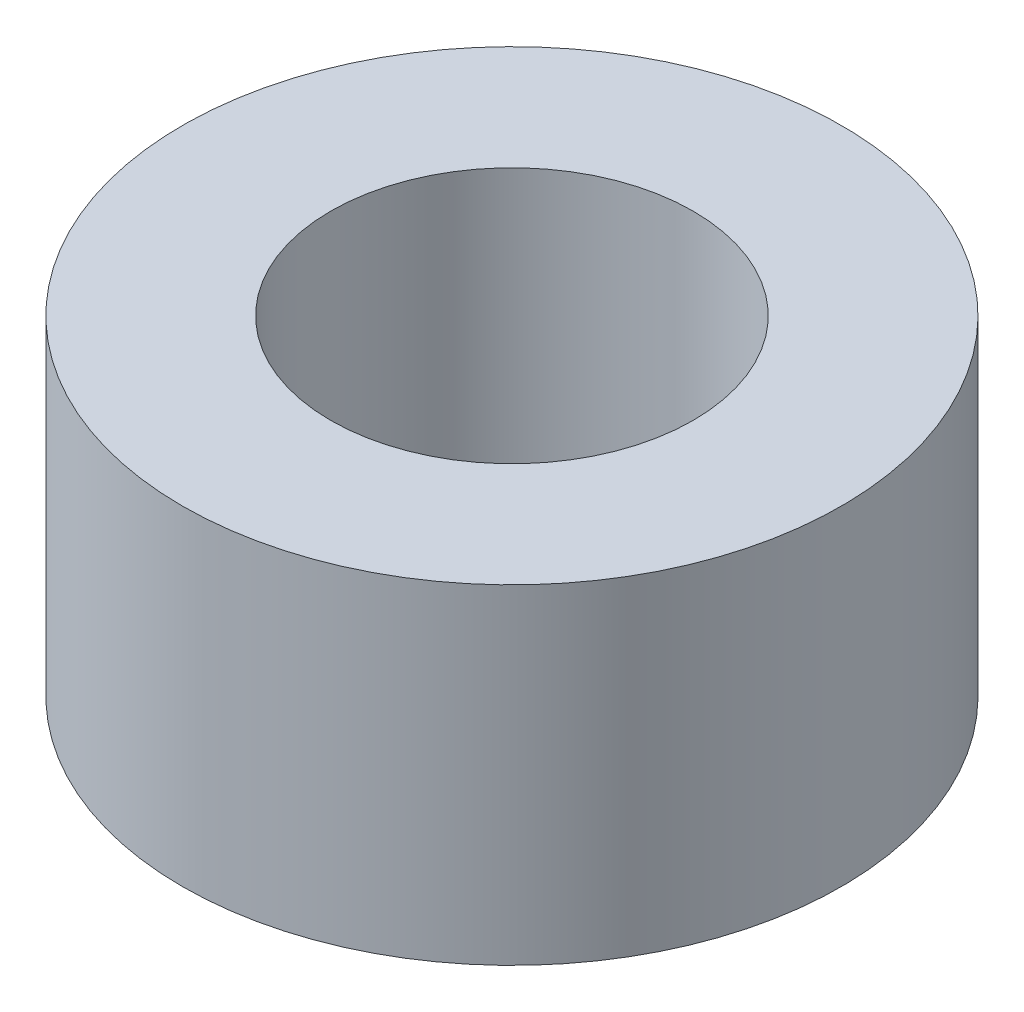
ISO-10303-21;
HEADER;
FILE_DESCRIPTION(('STEP AP214'),'2;1');
FILE_NAME('part.step','',(''),(''),'','','');
FILE_SCHEMA(('AUTOMOTIVE_DESIGN { 1 0 10303 214 1 1 1 1 }'));
ENDSEC;
DATA;
#1=APPLICATION_CONTEXT('core data for automotive mechanical design processes');
#2=APPLICATION_PROTOCOL_DEFINITION('international standard','automotive_design',2000,#1);
#3=PRODUCT_CONTEXT('',#1,'mechanical');
#4=PRODUCT('Part','Part','',(#3));
#5=PRODUCT_RELATED_PRODUCT_CATEGORY('part','',(#4));
#6=PRODUCT_DEFINITION_FORMATION('','',#4);
#7=PRODUCT_DEFINITION_CONTEXT('part definition',#1,'design');
#8=PRODUCT_DEFINITION('design','',#6,#7);
#9=PRODUCT_DEFINITION_SHAPE('','',#8);
#10=(LENGTH_UNIT() NAMED_UNIT(*) SI_UNIT(.MILLI.,.METRE.));
#11=(NAMED_UNIT(*) PLANE_ANGLE_UNIT() SI_UNIT($,.RADIAN.));
#12=(NAMED_UNIT(*) SI_UNIT($,.STERADIAN.) SOLID_ANGLE_UNIT());
#13=UNCERTAINTY_MEASURE_WITH_UNIT(LENGTH_MEASURE(1.E-05),#10,'distance_accuracy_value','');
#14=(GEOMETRIC_REPRESENTATION_CONTEXT(3) GLOBAL_UNCERTAINTY_ASSIGNED_CONTEXT((#13)) GLOBAL_UNIT_ASSIGNED_CONTEXT((#10,
#11,#12)) REPRESENTATION_CONTEXT('',''));
#15=CARTESIAN_POINT('',(0.,0.,0.));
#16=DIRECTION('',(0.,0.,1.));
#17=DIRECTION('',(1.,0.,0.));
#18=AXIS2_PLACEMENT_3D('',#15,#16,#17);
#19=CARTESIAN_POINT('',(0.,3.,0.));
#20=DIRECTION('',(0.,1.,0.));
#21=DIRECTION('',(0.,0.,1.));
#22=AXIS2_PLACEMENT_3D('',#19,#20,#21);
#23=PLANE('',#22);
#24=CARTESIAN_POINT('',(0.,3.,0.));
#25=DIRECTION('',(0.,1.,0.));
#26=DIRECTION('',(0.,0.,1.));
#27=AXIS2_PLACEMENT_3D('',#24,#25,#26);
#28=CIRCLE('',#27,3.);
#29=CARTESIAN_POINT('',(0.,3.,3.));
#30=VERTEX_POINT('',#29);
#31=EDGE_CURVE('E10',#30,#30,#28,.T.);
#32=ORIENTED_EDGE('',*,*,#31,.T.);
#33=EDGE_LOOP('',(#32));
#34=FACE_BOUND('',#33,.T.);
#35=CARTESIAN_POINT('',(0.,3.,0.));
#36=DIRECTION('',(0.,1.,0.));
#37=DIRECTION('',(0.,0.,1.));
#38=AXIS2_PLACEMENT_3D('',#35,#36,#37);
#39=CIRCLE('',#38,1.65);
#40=CARTESIAN_POINT('',(0.,3.,1.65));
#41=VERTEX_POINT('',#40);
#42=EDGE_CURVE('E44',#41,#41,#39,.T.);
#43=ORIENTED_EDGE('',*,*,#42,.F.);
#44=EDGE_LOOP('',(#43));
#45=FACE_BOUND('',#44,.T.);
#46=ADVANCED_FACE('F33',(#34,#45),#23,.T.);
#47=CARTESIAN_POINT('',(0.,0.,0.));
#48=DIRECTION('',(0.,1.,0.));
#49=DIRECTION('',(0.,0.,1.));
#50=AXIS2_PLACEMENT_3D('',#47,#48,#49);
#51=PLANE('',#50);
#52=CARTESIAN_POINT('',(0.,0.,0.));
#53=DIRECTION('',(0.,1.,0.));
#54=DIRECTION('',(0.,0.,1.));
#55=AXIS2_PLACEMENT_3D('',#52,#53,#54);
#56=CIRCLE('',#55,3.);
#57=CARTESIAN_POINT('',(0.,0.,3.));
#58=VERTEX_POINT('',#57);
#59=EDGE_CURVE('E37',#58,#58,#56,.T.);
#60=ORIENTED_EDGE('',*,*,#59,.F.);
#61=EDGE_LOOP('',(#60));
#62=FACE_BOUND('',#61,.T.);
#63=CARTESIAN_POINT('',(0.,0.,0.));
#64=DIRECTION('',(0.,1.,0.));
#65=DIRECTION('',(0.,0.,1.));
#66=AXIS2_PLACEMENT_3D('',#63,#64,#65);
#67=CIRCLE('',#66,1.65);
#68=CARTESIAN_POINT('',(0.,0.,1.65));
#69=VERTEX_POINT('',#68);
#70=EDGE_CURVE('E46',#69,#69,#67,.T.);
#71=ORIENTED_EDGE('',*,*,#70,.T.);
#72=EDGE_LOOP('',(#71));
#73=FACE_BOUND('',#72,.T.);
#74=ADVANCED_FACE('F56',(#62,#73),#51,.F.);
#75=CARTESIAN_POINT('',(0.,3.,0.));
#76=DIRECTION('',(0.,-1.,0.));
#77=DIRECTION('',(0.,0.,-1.));
#78=AXIS2_PLACEMENT_3D('',#75,#76,#77);
#79=CYLINDRICAL_SURFACE('',#78,3.);
#80=ORIENTED_EDGE('',*,*,#31,.F.);
#81=EDGE_LOOP('',(#80));
#82=FACE_BOUND('',#81,.T.);
#83=ORIENTED_EDGE('',*,*,#59,.T.);
#84=EDGE_LOOP('',(#83));
#85=FACE_BOUND('',#84,.T.);
#86=ADVANCED_FACE('F35',(#82,#85),#79,.T.);
#87=CARTESIAN_POINT('',(0.,3.,0.));
#88=DIRECTION('',(0.,-1.,0.));
#89=DIRECTION('',(0.,0.,-1.));
#90=AXIS2_PLACEMENT_3D('',#87,#88,#89);
#91=CYLINDRICAL_SURFACE('',#90,1.65);
#92=ORIENTED_EDGE('',*,*,#42,.T.);
#93=EDGE_LOOP('',(#92));
#94=FACE_BOUND('',#93,.T.);
#95=ORIENTED_EDGE('',*,*,#70,.F.);
#96=EDGE_LOOP('',(#95));
#97=FACE_BOUND('',#96,.T.);
#98=ADVANCED_FACE('F52',(#94,#97),#91,.F.);
#99=CLOSED_SHELL('',(#46,#74,#86,#98));
#100=MANIFOLD_SOLID_BREP('B2',#99);
#101=ADVANCED_BREP_SHAPE_REPRESENTATION('',(#18,#100),#14);
#102=SHAPE_DEFINITION_REPRESENTATION(#9,#101);
ENDSEC;
END-ISO-10303-21;
